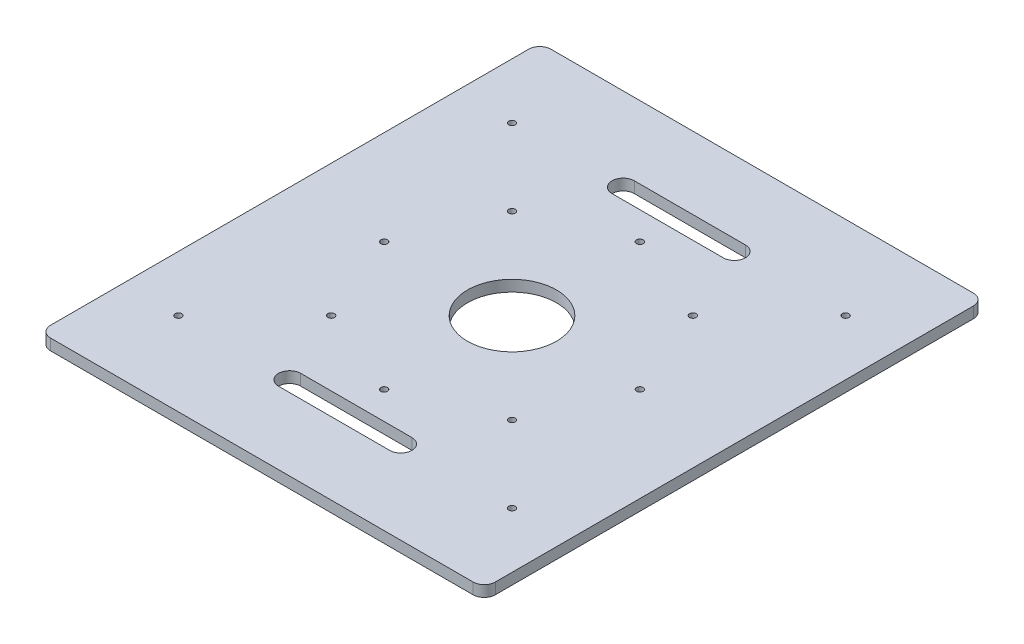
ISO-10303-21;
HEADER;
FILE_DESCRIPTION(('STEP AP214'),'2;1');
FILE_NAME('part.step','',(''),(''),'','','');
FILE_SCHEMA(('AUTOMOTIVE_DESIGN { 1 0 10303 214 1 1 1 1 }'));
ENDSEC;
DATA;
#1=APPLICATION_CONTEXT('core data for automotive mechanical design processes');
#2=APPLICATION_PROTOCOL_DEFINITION('international standard','automotive_design',2000,#1);
#3=PRODUCT_CONTEXT('',#1,'mechanical');
#4=PRODUCT('Part','Part','',(#3));
#5=PRODUCT_RELATED_PRODUCT_CATEGORY('part','',(#4));
#6=PRODUCT_DEFINITION_FORMATION('','',#4);
#7=PRODUCT_DEFINITION_CONTEXT('part definition',#1,'design');
#8=PRODUCT_DEFINITION('design','',#6,#7);
#9=PRODUCT_DEFINITION_SHAPE('','',#8);
#10=(LENGTH_UNIT() NAMED_UNIT(*) SI_UNIT(.MILLI.,.METRE.));
#11=(NAMED_UNIT(*) PLANE_ANGLE_UNIT() SI_UNIT($,.RADIAN.));
#12=(NAMED_UNIT(*) SI_UNIT($,.STERADIAN.) SOLID_ANGLE_UNIT());
#13=UNCERTAINTY_MEASURE_WITH_UNIT(LENGTH_MEASURE(1.E-05),#10,'distance_accuracy_value','');
#14=(GEOMETRIC_REPRESENTATION_CONTEXT(3) GLOBAL_UNCERTAINTY_ASSIGNED_CONTEXT((#13)) GLOBAL_UNIT_ASSIGNED_CONTEXT((#10,
#11,#12)) REPRESENTATION_CONTEXT('',''));
#15=CARTESIAN_POINT('',(0.,0.,0.));
#16=DIRECTION('',(0.,0.,1.));
#17=DIRECTION('',(1.,0.,0.));
#18=AXIS2_PLACEMENT_3D('',#15,#16,#17);
#19=CARTESIAN_POINT('',(190.,10.,-215.));
#20=DIRECTION('',(0.,-1.,0.));
#21=DIRECTION('',(0.,0.,-1.));
#22=AXIS2_PLACEMENT_3D('',#19,#20,#21);
#23=CYLINDRICAL_SURFACE('',#22,10.);
#24=CARTESIAN_POINT('',(190.,0.,-215.));
#25=DIRECTION('',(0.,1.,0.));
#26=DIRECTION('',(0.,0.,1.));
#27=AXIS2_PLACEMENT_3D('',#24,#25,#26);
#28=CIRCLE('',#27,10.);
#29=CARTESIAN_POINT('',(200.,0.,-215.));
#30=VERTEX_POINT('',#29);
#31=CARTESIAN_POINT('',(190.,0.,-225.));
#32=VERTEX_POINT('',#31);
#33=EDGE_CURVE('E300',#30,#32,#28,.T.);
#34=ORIENTED_EDGE('',*,*,#33,.T.);
#35=DIRECTION('',(0.,-1.,0.));
#36=VECTOR('',#35,1.);
#37=CARTESIAN_POINT('',(190.,10.,-225.));
#38=LINE('',#37,#36);
#39=CARTESIAN_POINT('',(190.,10.,-225.));
#40=VERTEX_POINT('',#39);
#41=EDGE_CURVE('E351',#40,#32,#38,.T.);
#42=ORIENTED_EDGE('',*,*,#41,.F.);
#43=CARTESIAN_POINT('',(190.,10.,-215.));
#44=DIRECTION('',(0.,1.,0.));
#45=DIRECTION('',(0.,0.,1.));
#46=AXIS2_PLACEMENT_3D('',#43,#44,#45);
#47=CIRCLE('',#46,10.);
#48=CARTESIAN_POINT('',(200.,10.,-215.));
#49=VERTEX_POINT('',#48);
#50=EDGE_CURVE('E273',#49,#40,#47,.T.);
#51=ORIENTED_EDGE('',*,*,#50,.F.);
#52=DIRECTION('',(0.,-1.,0.));
#53=VECTOR('',#52,1.);
#54=CARTESIAN_POINT('',(200.,10.,-215.));
#55=LINE('',#54,#53);
#56=EDGE_CURVE('E299',#49,#30,#55,.T.);
#57=ORIENTED_EDGE('',*,*,#56,.T.);
#58=EDGE_LOOP('',(#34,#42,#51,#57));
#59=FACE_BOUND('',#58,.T.);
#60=ADVANCED_FACE('F39',(#59),#23,.T.);
#61=CARTESIAN_POINT('',(-190.,10.,-225.));
#62=DIRECTION('',(0.,0.,1.));
#63=DIRECTION('',(1.,0.,0.));
#64=AXIS2_PLACEMENT_3D('',#61,#62,#63);
#65=PLANE('',#64);
#66=DIRECTION('',(-1.,0.,0.));
#67=VECTOR('',#66,1.);
#68=CARTESIAN_POINT('',(-190.,0.,-225.));
#69=LINE('',#68,#67);
#70=CARTESIAN_POINT('',(-190.,0.,-225.));
#71=VERTEX_POINT('',#70);
#72=EDGE_CURVE('E304',#32,#71,#69,.T.);
#73=ORIENTED_EDGE('',*,*,#72,.T.);
#74=DIRECTION('',(0.,-1.,0.));
#75=VECTOR('',#74,1.);
#76=CARTESIAN_POINT('',(-190.,10.,-225.));
#77=LINE('',#76,#75);
#78=CARTESIAN_POINT('',(-190.,10.,-225.));
#79=VERTEX_POINT('',#78);
#80=EDGE_CURVE('E347',#79,#71,#77,.T.);
#81=ORIENTED_EDGE('',*,*,#80,.F.);
#82=DIRECTION('',(-1.,0.,0.));
#83=VECTOR('',#82,1.);
#84=CARTESIAN_POINT('',(-190.,10.,-225.));
#85=LINE('',#84,#83);
#86=EDGE_CURVE('E277',#40,#79,#85,.T.);
#87=ORIENTED_EDGE('',*,*,#86,.F.);
#88=ORIENTED_EDGE('',*,*,#41,.T.);
#89=EDGE_LOOP('',(#73,#81,#87,#88));
#90=FACE_BOUND('',#89,.T.);
#91=ADVANCED_FACE('F445',(#90),#65,.F.);
#92=CARTESIAN_POINT('',(-190.,10.,-215.));
#93=DIRECTION('',(0.,-1.,0.));
#94=DIRECTION('',(0.,0.,-1.));
#95=AXIS2_PLACEMENT_3D('',#92,#93,#94);
#96=CYLINDRICAL_SURFACE('',#95,10.);
#97=CARTESIAN_POINT('',(-190.,0.,-215.));
#98=DIRECTION('',(0.,1.,0.));
#99=DIRECTION('',(0.,0.,1.));
#100=AXIS2_PLACEMENT_3D('',#97,#98,#99);
#101=CIRCLE('',#100,10.);
#102=CARTESIAN_POINT('',(-200.,0.,-215.));
#103=VERTEX_POINT('',#102);
#104=EDGE_CURVE('E307',#71,#103,#101,.T.);
#105=ORIENTED_EDGE('',*,*,#104,.T.);
#106=DIRECTION('',(0.,-1.,0.));
#107=VECTOR('',#106,1.);
#108=CARTESIAN_POINT('',(-200.,10.,-215.));
#109=LINE('',#108,#107);
#110=CARTESIAN_POINT('',(-200.,10.,-215.));
#111=VERTEX_POINT('',#110);
#112=EDGE_CURVE('E343',#111,#103,#109,.T.);
#113=ORIENTED_EDGE('',*,*,#112,.F.);
#114=CARTESIAN_POINT('',(-190.,10.,-215.));
#115=DIRECTION('',(0.,1.,0.));
#116=DIRECTION('',(0.,0.,1.));
#117=AXIS2_PLACEMENT_3D('',#114,#115,#116);
#118=CIRCLE('',#117,10.);
#119=EDGE_CURVE('E281',#79,#111,#118,.T.);
#120=ORIENTED_EDGE('',*,*,#119,.F.);
#121=ORIENTED_EDGE('',*,*,#80,.T.);
#122=EDGE_LOOP('',(#105,#113,#120,#121));
#123=FACE_BOUND('',#122,.T.);
#124=ADVANCED_FACE('F450',(#123),#96,.T.);
#125=CARTESIAN_POINT('',(-200.,10.,-215.));
#126=DIRECTION('',(1.,0.,0.));
#127=DIRECTION('',(0.,0.,-1.));
#128=AXIS2_PLACEMENT_3D('',#125,#126,#127);
#129=PLANE('',#128);
#130=DIRECTION('',(0.,0.,1.));
#131=VECTOR('',#130,1.);
#132=CARTESIAN_POINT('',(-200.,0.,-215.));
#133=LINE('',#132,#131);
#134=CARTESIAN_POINT('',(-200.,0.,215.));
#135=VERTEX_POINT('',#134);
#136=EDGE_CURVE('E310',#103,#135,#133,.T.);
#137=ORIENTED_EDGE('',*,*,#136,.T.);
#138=DIRECTION('',(0.,-1.,0.));
#139=VECTOR('',#138,1.);
#140=CARTESIAN_POINT('',(-200.,10.,215.));
#141=LINE('',#140,#139);
#142=CARTESIAN_POINT('',(-200.,10.,215.));
#143=VERTEX_POINT('',#142);
#144=EDGE_CURVE('E339',#143,#135,#141,.T.);
#145=ORIENTED_EDGE('',*,*,#144,.F.);
#146=DIRECTION('',(0.,0.,1.));
#147=VECTOR('',#146,1.);
#148=CARTESIAN_POINT('',(-200.,10.,-215.));
#149=LINE('',#148,#147);
#150=EDGE_CURVE('E284',#111,#143,#149,.T.);
#151=ORIENTED_EDGE('',*,*,#150,.F.);
#152=ORIENTED_EDGE('',*,*,#112,.T.);
#153=EDGE_LOOP('',(#137,#145,#151,#152));
#154=FACE_BOUND('',#153,.T.);
#155=ADVANCED_FACE('F484',(#154),#129,.F.);
#156=CARTESIAN_POINT('',(-190.,10.,215.));
#157=DIRECTION('',(0.,-1.,0.));
#158=DIRECTION('',(0.,0.,-1.));
#159=AXIS2_PLACEMENT_3D('',#156,#157,#158);
#160=CYLINDRICAL_SURFACE('',#159,10.);
#161=CARTESIAN_POINT('',(-190.,0.,215.));
#162=DIRECTION('',(0.,1.,0.));
#163=DIRECTION('',(0.,0.,1.));
#164=AXIS2_PLACEMENT_3D('',#161,#162,#163);
#165=CIRCLE('',#164,10.);
#166=CARTESIAN_POINT('',(-190.,0.,225.));
#167=VERTEX_POINT('',#166);
#168=EDGE_CURVE('E313',#135,#167,#165,.T.);
#169=ORIENTED_EDGE('',*,*,#168,.T.);
#170=DIRECTION('',(0.,-1.,0.));
#171=VECTOR('',#170,1.);
#172=CARTESIAN_POINT('',(-190.,10.,225.));
#173=LINE('',#172,#171);
#174=CARTESIAN_POINT('',(-190.,10.,225.));
#175=VERTEX_POINT('',#174);
#176=EDGE_CURVE('E335',#175,#167,#173,.T.);
#177=ORIENTED_EDGE('',*,*,#176,.F.);
#178=CARTESIAN_POINT('',(-190.,10.,215.));
#179=DIRECTION('',(0.,1.,0.));
#180=DIRECTION('',(0.,0.,1.));
#181=AXIS2_PLACEMENT_3D('',#178,#179,#180);
#182=CIRCLE('',#181,10.);
#183=EDGE_CURVE('E287',#143,#175,#182,.T.);
#184=ORIENTED_EDGE('',*,*,#183,.F.);
#185=ORIENTED_EDGE('',*,*,#144,.T.);
#186=EDGE_LOOP('',(#169,#177,#184,#185));
#187=FACE_BOUND('',#186,.T.);
#188=ADVANCED_FACE('F480',(#187),#160,.T.);
#189=CARTESIAN_POINT('',(-190.,10.,225.));
#190=DIRECTION('',(0.,0.,-1.));
#191=DIRECTION('',(-1.,0.,0.));
#192=AXIS2_PLACEMENT_3D('',#189,#190,#191);
#193=PLANE('',#192);
#194=DIRECTION('',(1.,0.,0.));
#195=VECTOR('',#194,1.);
#196=CARTESIAN_POINT('',(-190.,0.,225.));
#197=LINE('',#196,#195);
#198=CARTESIAN_POINT('',(190.,0.,225.));
#199=VERTEX_POINT('',#198);
#200=EDGE_CURVE('E316',#167,#199,#197,.T.);
#201=ORIENTED_EDGE('',*,*,#200,.T.);
#202=DIRECTION('',(0.,-1.,0.));
#203=VECTOR('',#202,1.);
#204=CARTESIAN_POINT('',(190.,10.,225.));
#205=LINE('',#204,#203);
#206=CARTESIAN_POINT('',(190.,10.,225.));
#207=VERTEX_POINT('',#206);
#208=EDGE_CURVE('E331',#207,#199,#205,.T.);
#209=ORIENTED_EDGE('',*,*,#208,.F.);
#210=DIRECTION('',(1.,0.,0.));
#211=VECTOR('',#210,1.);
#212=CARTESIAN_POINT('',(-190.,10.,225.));
#213=LINE('',#212,#211);
#214=EDGE_CURVE('E290',#175,#207,#213,.T.);
#215=ORIENTED_EDGE('',*,*,#214,.F.);
#216=ORIENTED_EDGE('',*,*,#176,.T.);
#217=EDGE_LOOP('',(#201,#209,#215,#216));
#218=FACE_BOUND('',#217,.T.);
#219=ADVANCED_FACE('F475',(#218),#193,.F.);
#220=CARTESIAN_POINT('',(190.,10.,215.));
#221=DIRECTION('',(0.,-1.,0.));
#222=DIRECTION('',(0.,0.,-1.));
#223=AXIS2_PLACEMENT_3D('',#220,#221,#222);
#224=CYLINDRICAL_SURFACE('',#223,9.99999999999999);
#225=CARTESIAN_POINT('',(190.,0.,215.));
#226=DIRECTION('',(0.,1.,0.));
#227=DIRECTION('',(0.,0.,1.));
#228=AXIS2_PLACEMENT_3D('',#225,#226,#227);
#229=CIRCLE('',#228,9.99999999999999);
#230=CARTESIAN_POINT('',(200.,0.,215.));
#231=VERTEX_POINT('',#230);
#232=EDGE_CURVE('E319',#199,#231,#229,.T.);
#233=ORIENTED_EDGE('',*,*,#232,.T.);
#234=DIRECTION('',(0.,-1.,0.));
#235=VECTOR('',#234,1.);
#236=CARTESIAN_POINT('',(200.,10.,215.));
#237=LINE('',#236,#235);
#238=CARTESIAN_POINT('',(200.,10.,215.));
#239=VERTEX_POINT('',#238);
#240=EDGE_CURVE('E327',#239,#231,#237,.T.);
#241=ORIENTED_EDGE('',*,*,#240,.F.);
#242=CARTESIAN_POINT('',(190.,10.,215.));
#243=DIRECTION('',(0.,1.,0.));
#244=DIRECTION('',(0.,0.,1.));
#245=AXIS2_PLACEMENT_3D('',#242,#243,#244);
#246=CIRCLE('',#245,9.99999999999999);
#247=EDGE_CURVE('E293',#207,#239,#246,.T.);
#248=ORIENTED_EDGE('',*,*,#247,.F.);
#249=ORIENTED_EDGE('',*,*,#208,.T.);
#250=EDGE_LOOP('',(#233,#241,#248,#249));
#251=FACE_BOUND('',#250,.T.);
#252=ADVANCED_FACE('F470',(#251),#224,.T.);
#253=CARTESIAN_POINT('',(200.,10.,-215.));
#254=DIRECTION('',(-1.,0.,0.));
#255=DIRECTION('',(0.,0.,1.));
#256=AXIS2_PLACEMENT_3D('',#253,#254,#255);
#257=PLANE('',#256);
#258=DIRECTION('',(0.,0.,-1.));
#259=VECTOR('',#258,1.);
#260=CARTESIAN_POINT('',(200.,0.,-215.));
#261=LINE('',#260,#259);
#262=EDGE_CURVE('E278',#231,#30,#261,.T.);
#263=ORIENTED_EDGE('',*,*,#262,.T.);
#264=ORIENTED_EDGE('',*,*,#56,.F.);
#265=DIRECTION('',(0.,0.,-1.));
#266=VECTOR('',#265,1.);
#267=CARTESIAN_POINT('',(200.,10.,-215.));
#268=LINE('',#267,#266);
#269=EDGE_CURVE('E296',#239,#49,#268,.T.);
#270=ORIENTED_EDGE('',*,*,#269,.F.);
#271=ORIENTED_EDGE('',*,*,#240,.T.);
#272=EDGE_LOOP('',(#263,#264,#270,#271));
#273=FACE_BOUND('',#272,.T.);
#274=ADVANCED_FACE('F468',(#273),#257,.F.);
#275=CARTESIAN_POINT('',(190.,10.,-215.));
#276=DIRECTION('',(0.,1.,0.));
#277=DIRECTION('',(0.,0.,1.));
#278=AXIS2_PLACEMENT_3D('',#275,#276,#277);
#279=PLANE('',#278);
#280=CARTESIAN_POINT('',(-81.317279836453,10.,-81.317279836453));
#281=DIRECTION('',(0.,1.,0.));
#282=DIRECTION('',(0.,0.,1.));
#283=AXIS2_PLACEMENT_3D('',#280,#281,#282);
#284=CIRCLE('',#283,3.00000000000001);
#285=CARTESIAN_POINT('',(-81.317279836453,10.,-78.317279836453));
#286=VERTEX_POINT('',#285);
#287=EDGE_CURVE('E225',#286,#286,#284,.T.);
#288=ORIENTED_EDGE('',*,*,#287,.F.);
#289=EDGE_LOOP('',(#288));
#290=FACE_BOUND('',#289,.T.);
#291=CARTESIAN_POINT('',(-115.,10.,0.));
#292=DIRECTION('',(0.,1.,0.));
#293=DIRECTION('',(0.,0.,1.));
#294=AXIS2_PLACEMENT_3D('',#291,#292,#293);
#295=CIRCLE('',#294,2.99999999999999);
#296=CARTESIAN_POINT('',(-115.,10.,3.00000000000001));
#297=VERTEX_POINT('',#296);
#298=EDGE_CURVE('E246',#297,#297,#295,.T.);
#299=ORIENTED_EDGE('',*,*,#298,.F.);
#300=EDGE_LOOP('',(#299));
#301=FACE_BOUND('',#300,.T.);
#302=CARTESIAN_POINT('',(-81.317279836453,10.,81.317279836453));
#303=DIRECTION('',(0.,1.,0.));
#304=DIRECTION('',(0.,0.,1.));
#305=AXIS2_PLACEMENT_3D('',#302,#303,#304);
#306=CIRCLE('',#305,3.00000000000001);
#307=CARTESIAN_POINT('',(-81.317279836453,10.,84.317279836453));
#308=VERTEX_POINT('',#307);
#309=EDGE_CURVE('E242',#308,#308,#306,.T.);
#310=ORIENTED_EDGE('',*,*,#309,.F.);
#311=EDGE_LOOP('',(#310));
#312=FACE_BOUND('',#311,.T.);
#313=CARTESIAN_POINT('',(0.,10.,115.));
#314=DIRECTION('',(0.,1.,0.));
#315=DIRECTION('',(0.,0.,1.));
#316=AXIS2_PLACEMENT_3D('',#313,#314,#315);
#317=CIRCLE('',#316,3.);
#318=CARTESIAN_POINT('',(0.,10.,118.));
#319=VERTEX_POINT('',#318);
#320=EDGE_CURVE('E237',#319,#319,#317,.T.);
#321=ORIENTED_EDGE('',*,*,#320,.F.);
#322=EDGE_LOOP('',(#321));
#323=FACE_BOUND('',#322,.T.);
#324=CARTESIAN_POINT('',(81.317279836453,10.,81.317279836453));
#325=DIRECTION('',(0.,1.,0.));
#326=DIRECTION('',(0.,0.,1.));
#327=AXIS2_PLACEMENT_3D('',#324,#325,#326);
#328=CIRCLE('',#327,3.00000000000001);
#329=CARTESIAN_POINT('',(81.317279836453,10.,84.317279836453));
#330=VERTEX_POINT('',#329);
#331=EDGE_CURVE('E241',#330,#330,#328,.T.);
#332=ORIENTED_EDGE('',*,*,#331,.F.);
#333=EDGE_LOOP('',(#332));
#334=FACE_BOUND('',#333,.T.);
#335=CARTESIAN_POINT('',(115.,10.,0.));
#336=DIRECTION('',(0.,1.,0.));
#337=DIRECTION('',(0.,0.,1.));
#338=AXIS2_PLACEMENT_3D('',#335,#336,#337);
#339=CIRCLE('',#338,3.00000000000001);
#340=CARTESIAN_POINT('',(115.,10.,3.));
#341=VERTEX_POINT('',#340);
#342=EDGE_CURVE('E262',#341,#341,#339,.T.);
#343=ORIENTED_EDGE('',*,*,#342,.F.);
#344=EDGE_LOOP('',(#343));
#345=FACE_BOUND('',#344,.T.);
#346=CARTESIAN_POINT('',(81.317279836453,10.,-81.317279836453));
#347=DIRECTION('',(0.,1.,0.));
#348=DIRECTION('',(0.,0.,1.));
#349=AXIS2_PLACEMENT_3D('',#346,#347,#348);
#350=CIRCLE('',#349,2.99999999999999);
#351=CARTESIAN_POINT('',(81.317279836453,10.,-78.317279836453));
#352=VERTEX_POINT('',#351);
#353=EDGE_CURVE('E258',#352,#352,#350,.T.);
#354=ORIENTED_EDGE('',*,*,#353,.F.);
#355=EDGE_LOOP('',(#354));
#356=FACE_BOUND('',#355,.T.);
#357=CARTESIAN_POINT('',(0.,10.,-115.));
#358=DIRECTION('',(0.,1.,0.));
#359=DIRECTION('',(0.,0.,1.));
#360=AXIS2_PLACEMENT_3D('',#357,#358,#359);
#361=CIRCLE('',#360,3.);
#362=CARTESIAN_POINT('',(0.,10.,-112.));
#363=VERTEX_POINT('',#362);
#364=EDGE_CURVE('E253',#363,#363,#361,.T.);
#365=ORIENTED_EDGE('',*,*,#364,.F.);
#366=EDGE_LOOP('',(#365));
#367=FACE_BOUND('',#366,.T.);
#368=CARTESIAN_POINT('',(-50.,10.,-150.));
#369=DIRECTION('',(0.,1.,0.));
#370=DIRECTION('',(0.,0.,-1.));
#371=AXIS2_PLACEMENT_3D('',#368,#369,#370);
#372=CIRCLE('',#371,10.);
#373=CARTESIAN_POINT('',(-50.,10.,-160.));
#374=VERTEX_POINT('',#373);
#375=CARTESIAN_POINT('',(-50.,10.,-140.));
#376=VERTEX_POINT('',#375);
#377=EDGE_CURVE('E56',#374,#376,#372,.T.);
#378=ORIENTED_EDGE('',*,*,#377,.F.);
#379=DIRECTION('',(-1.,0.,0.));
#380=VECTOR('',#379,1.);
#381=CARTESIAN_POINT('',(-50.,10.,-160.));
#382=LINE('',#381,#380);
#383=CARTESIAN_POINT('',(50.,10.,-160.));
#384=VERTEX_POINT('',#383);
#385=EDGE_CURVE('E205',#384,#374,#382,.T.);
#386=ORIENTED_EDGE('',*,*,#385,.F.);
#387=CARTESIAN_POINT('',(50.,10.,-150.));
#388=DIRECTION('',(0.,1.,0.));
#389=DIRECTION('',(0.,0.,-1.));
#390=AXIS2_PLACEMENT_3D('',#387,#388,#389);
#391=CIRCLE('',#390,10.);
#392=CARTESIAN_POINT('',(50.,10.,-140.));
#393=VERTEX_POINT('',#392);
#394=EDGE_CURVE('E201',#393,#384,#391,.T.);
#395=ORIENTED_EDGE('',*,*,#394,.F.);
#396=DIRECTION('',(1.,0.,0.));
#397=VECTOR('',#396,1.);
#398=CARTESIAN_POINT('',(-50.,10.,-140.));
#399=LINE('',#398,#397);
#400=EDGE_CURVE('E197',#376,#393,#399,.T.);
#401=ORIENTED_EDGE('',*,*,#400,.F.);
#402=EDGE_LOOP('',(#378,#386,#395,#401));
#403=FACE_BOUND('',#402,.T.);
#404=CARTESIAN_POINT('',(-50.,10.,150.));
#405=DIRECTION('',(0.,1.,0.));
#406=DIRECTION('',(0.,0.,1.));
#407=AXIS2_PLACEMENT_3D('',#404,#405,#406);
#408=CIRCLE('',#407,10.);
#409=CARTESIAN_POINT('',(-50.,10.,140.));
#410=VERTEX_POINT('',#409);
#411=CARTESIAN_POINT('',(-50.,10.,160.));
#412=VERTEX_POINT('',#411);
#413=EDGE_CURVE('E64',#410,#412,#408,.T.);
#414=ORIENTED_EDGE('',*,*,#413,.F.);
#415=DIRECTION('',(-1.,0.,0.));
#416=VECTOR('',#415,1.);
#417=CARTESIAN_POINT('',(-50.,10.,140.));
#418=LINE('',#417,#416);
#419=CARTESIAN_POINT('',(50.,10.,140.));
#420=VERTEX_POINT('',#419);
#421=EDGE_CURVE('E180',#420,#410,#418,.T.);
#422=ORIENTED_EDGE('',*,*,#421,.F.);
#423=CARTESIAN_POINT('',(50.,10.,150.));
#424=DIRECTION('',(0.,1.,0.));
#425=DIRECTION('',(0.,0.,1.));
#426=AXIS2_PLACEMENT_3D('',#423,#424,#425);
#427=CIRCLE('',#426,10.);
#428=CARTESIAN_POINT('',(50.,10.,160.));
#429=VERTEX_POINT('',#428);
#430=EDGE_CURVE('E161',#429,#420,#427,.T.);
#431=ORIENTED_EDGE('',*,*,#430,.F.);
#432=DIRECTION('',(1.,0.,0.));
#433=VECTOR('',#432,1.);
#434=CARTESIAN_POINT('',(-50.,10.,160.));
#435=LINE('',#434,#433);
#436=EDGE_CURVE('E172',#412,#429,#435,.T.);
#437=ORIENTED_EDGE('',*,*,#436,.F.);
#438=EDGE_LOOP('',(#414,#422,#431,#437));
#439=FACE_BOUND('',#438,.T.);
#440=CARTESIAN_POINT('',(150.,10.,150.));
#441=DIRECTION('',(0.,1.,0.));
#442=DIRECTION('',(0.,0.,1.));
#443=AXIS2_PLACEMENT_3D('',#440,#441,#442);
#444=CIRCLE('',#443,3.00000000000002);
#445=CARTESIAN_POINT('',(150.,10.,153.));
#446=VERTEX_POINT('',#445);
#447=EDGE_CURVE('E190',#446,#446,#444,.T.);
#448=ORIENTED_EDGE('',*,*,#447,.F.);
#449=EDGE_LOOP('',(#448));
#450=FACE_BOUND('',#449,.T.);
#451=CARTESIAN_POINT('',(-150.,10.,150.));
#452=DIRECTION('',(0.,1.,0.));
#453=DIRECTION('',(0.,0.,1.));
#454=AXIS2_PLACEMENT_3D('',#451,#452,#453);
#455=CIRCLE('',#454,2.99999999999999);
#456=CARTESIAN_POINT('',(-150.,10.,153.));
#457=VERTEX_POINT('',#456);
#458=EDGE_CURVE('E230',#457,#457,#455,.T.);
#459=ORIENTED_EDGE('',*,*,#458,.F.);
#460=EDGE_LOOP('',(#459));
#461=FACE_BOUND('',#460,.T.);
#462=CARTESIAN_POINT('',(150.,10.,-150.));
#463=DIRECTION('',(0.,1.,0.));
#464=DIRECTION('',(0.,0.,1.));
#465=AXIS2_PLACEMENT_3D('',#462,#463,#464);
#466=CIRCLE('',#465,2.99999999999999);
#467=CARTESIAN_POINT('',(150.,10.,-147.));
#468=VERTEX_POINT('',#467);
#469=EDGE_CURVE('E226',#468,#468,#466,.T.);
#470=ORIENTED_EDGE('',*,*,#469,.F.);
#471=EDGE_LOOP('',(#470));
#472=FACE_BOUND('',#471,.T.);
#473=CARTESIAN_POINT('',(-150.,10.,-150.));
#474=DIRECTION('',(0.,1.,0.));
#475=DIRECTION('',(0.,0.,1.));
#476=AXIS2_PLACEMENT_3D('',#473,#474,#475);
#477=CIRCLE('',#476,2.99999999999999);
#478=CARTESIAN_POINT('',(-150.,10.,-147.));
#479=VERTEX_POINT('',#478);
#480=EDGE_CURVE('E221',#479,#479,#477,.T.);
#481=ORIENTED_EDGE('',*,*,#480,.F.);
#482=EDGE_LOOP('',(#481));
#483=FACE_BOUND('',#482,.T.);
#484=CARTESIAN_POINT('',(0.,10.,0.));
#485=DIRECTION('',(0.,1.,0.));
#486=DIRECTION('',(0.,0.,1.));
#487=AXIS2_PLACEMENT_3D('',#484,#485,#486);
#488=CIRCLE('',#487,40.);
#489=CARTESIAN_POINT('',(0.,10.,40.));
#490=VERTEX_POINT('',#489);
#491=EDGE_CURVE('E257',#490,#490,#488,.T.);
#492=ORIENTED_EDGE('',*,*,#491,.F.);
#493=EDGE_LOOP('',(#492));
#494=FACE_BOUND('',#493,.T.);
#495=ORIENTED_EDGE('',*,*,#50,.T.);
#496=ORIENTED_EDGE('',*,*,#86,.T.);
#497=ORIENTED_EDGE('',*,*,#119,.T.);
#498=ORIENTED_EDGE('',*,*,#150,.T.);
#499=ORIENTED_EDGE('',*,*,#183,.T.);
#500=ORIENTED_EDGE('',*,*,#214,.T.);
#501=ORIENTED_EDGE('',*,*,#247,.T.);
#502=ORIENTED_EDGE('',*,*,#269,.T.);
#503=EDGE_LOOP('',(#495,#496,#497,#498,#499,#500,#501,#502));
#504=FACE_BOUND('',#503,.T.);
#505=ADVANCED_FACE('F177',(#290,#301,#312,#323,#334,#345,#356,#367,#403,#439,#450,#461,#472,
#483,#494,#504),#279,.T.);
#506=CARTESIAN_POINT('',(190.,0.,-215.));
#507=DIRECTION('',(0.,1.,0.));
#508=DIRECTION('',(0.,0.,1.));
#509=AXIS2_PLACEMENT_3D('',#506,#507,#508);
#510=PLANE('',#509);
#511=CARTESIAN_POINT('',(-81.317279836453,0.,-81.317279836453));
#512=DIRECTION('',(0.,1.,0.));
#513=DIRECTION('',(0.,0.,1.));
#514=AXIS2_PLACEMENT_3D('',#511,#512,#513);
#515=CIRCLE('',#514,3.00000000000001);
#516=CARTESIAN_POINT('',(-81.317279836453,0.,-78.317279836453));
#517=VERTEX_POINT('',#516);
#518=EDGE_CURVE('E42',#517,#517,#515,.T.);
#519=ORIENTED_EDGE('',*,*,#518,.T.);
#520=EDGE_LOOP('',(#519));
#521=FACE_BOUND('',#520,.T.);
#522=CARTESIAN_POINT('',(-115.,0.,0.));
#523=DIRECTION('',(0.,1.,0.));
#524=DIRECTION('',(0.,0.,1.));
#525=AXIS2_PLACEMENT_3D('',#522,#523,#524);
#526=CIRCLE('',#525,2.99999999999999);
#527=CARTESIAN_POINT('',(-115.,0.,3.00000000000001));
#528=VERTEX_POINT('',#527);
#529=EDGE_CURVE('E421',#528,#528,#526,.T.);
#530=ORIENTED_EDGE('',*,*,#529,.T.);
#531=EDGE_LOOP('',(#530));
#532=FACE_BOUND('',#531,.T.);
#533=CARTESIAN_POINT('',(-81.317279836453,0.,81.317279836453));
#534=DIRECTION('',(0.,1.,0.));
#535=DIRECTION('',(0.,0.,1.));
#536=AXIS2_PLACEMENT_3D('',#533,#534,#535);
#537=CIRCLE('',#536,3.00000000000001);
#538=CARTESIAN_POINT('',(-81.317279836453,0.,84.317279836453));
#539=VERTEX_POINT('',#538);
#540=EDGE_CURVE('E418',#539,#539,#537,.T.);
#541=ORIENTED_EDGE('',*,*,#540,.T.);
#542=EDGE_LOOP('',(#541));
#543=FACE_BOUND('',#542,.T.);
#544=CARTESIAN_POINT('',(0.,0.,115.));
#545=DIRECTION('',(0.,1.,0.));
#546=DIRECTION('',(0.,0.,1.));
#547=AXIS2_PLACEMENT_3D('',#544,#545,#546);
#548=CIRCLE('',#547,3.);
#549=CARTESIAN_POINT('',(0.,0.,118.));
#550=VERTEX_POINT('',#549);
#551=EDGE_CURVE('E414',#550,#550,#548,.T.);
#552=ORIENTED_EDGE('',*,*,#551,.T.);
#553=EDGE_LOOP('',(#552));
#554=FACE_BOUND('',#553,.T.);
#555=CARTESIAN_POINT('',(81.317279836453,0.,81.317279836453));
#556=DIRECTION('',(0.,1.,0.));
#557=DIRECTION('',(0.,0.,1.));
#558=AXIS2_PLACEMENT_3D('',#555,#556,#557);
#559=CIRCLE('',#558,3.00000000000001);
#560=CARTESIAN_POINT('',(81.317279836453,0.,84.317279836453));
#561=VERTEX_POINT('',#560);
#562=EDGE_CURVE('E410',#561,#561,#559,.T.);
#563=ORIENTED_EDGE('',*,*,#562,.T.);
#564=EDGE_LOOP('',(#563));
#565=FACE_BOUND('',#564,.T.);
#566=CARTESIAN_POINT('',(115.,0.,0.));
#567=DIRECTION('',(0.,1.,0.));
#568=DIRECTION('',(0.,0.,1.));
#569=AXIS2_PLACEMENT_3D('',#566,#567,#568);
#570=CIRCLE('',#569,3.00000000000001);
#571=CARTESIAN_POINT('',(115.,0.,3.));
#572=VERTEX_POINT('',#571);
#573=EDGE_CURVE('E406',#572,#572,#570,.T.);
#574=ORIENTED_EDGE('',*,*,#573,.T.);
#575=EDGE_LOOP('',(#574));
#576=FACE_BOUND('',#575,.T.);
#577=CARTESIAN_POINT('',(81.317279836453,0.,-81.317279836453));
#578=DIRECTION('',(0.,1.,0.));
#579=DIRECTION('',(0.,0.,1.));
#580=AXIS2_PLACEMENT_3D('',#577,#578,#579);
#581=CIRCLE('',#580,2.99999999999999);
#582=CARTESIAN_POINT('',(81.317279836453,0.,-78.317279836453));
#583=VERTEX_POINT('',#582);
#584=EDGE_CURVE('E402',#583,#583,#581,.T.);
#585=ORIENTED_EDGE('',*,*,#584,.T.);
#586=EDGE_LOOP('',(#585));
#587=FACE_BOUND('',#586,.T.);
#588=CARTESIAN_POINT('',(0.,0.,-115.));
#589=DIRECTION('',(0.,1.,0.));
#590=DIRECTION('',(0.,0.,1.));
#591=AXIS2_PLACEMENT_3D('',#588,#589,#590);
#592=CIRCLE('',#591,3.);
#593=CARTESIAN_POINT('',(0.,0.,-112.));
#594=VERTEX_POINT('',#593);
#595=EDGE_CURVE('E375',#594,#594,#592,.T.);
#596=ORIENTED_EDGE('',*,*,#595,.T.);
#597=EDGE_LOOP('',(#596));
#598=FACE_BOUND('',#597,.T.);
#599=DIRECTION('',(-1.,0.,0.));
#600=VECTOR('',#599,1.);
#601=CARTESIAN_POINT('',(190.,0.,-160.));
#602=LINE('',#601,#600);
#603=CARTESIAN_POINT('',(50.,0.,-160.));
#604=VERTEX_POINT('',#603);
#605=CARTESIAN_POINT('',(-50.,0.,-160.));
#606=VERTEX_POINT('',#605);
#607=EDGE_CURVE('E48',#604,#606,#602,.T.);
#608=ORIENTED_EDGE('',*,*,#607,.T.);
#609=CARTESIAN_POINT('',(-50.,0.,-150.));
#610=DIRECTION('',(0.,1.,0.));
#611=DIRECTION('',(0.,0.,1.));
#612=AXIS2_PLACEMENT_3D('',#609,#610,#611);
#613=CIRCLE('',#612,10.);
#614=CARTESIAN_POINT('',(-50.,0.,-140.));
#615=VERTEX_POINT('',#614);
#616=EDGE_CURVE('E11',#606,#615,#613,.T.);
#617=ORIENTED_EDGE('',*,*,#616,.T.);
#618=DIRECTION('',(1.,0.,0.));
#619=VECTOR('',#618,1.);
#620=CARTESIAN_POINT('',(190.,0.,-140.));
#621=LINE('',#620,#619);
#622=CARTESIAN_POINT('',(50.,0.,-140.));
#623=VERTEX_POINT('',#622);
#624=EDGE_CURVE('E388',#615,#623,#621,.T.);
#625=ORIENTED_EDGE('',*,*,#624,.T.);
#626=CARTESIAN_POINT('',(50.,0.,-150.));
#627=DIRECTION('',(0.,1.,0.));
#628=DIRECTION('',(0.,0.,1.));
#629=AXIS2_PLACEMENT_3D('',#626,#627,#628);
#630=CIRCLE('',#629,10.);
#631=EDGE_CURVE('E392',#623,#604,#630,.T.);
#632=ORIENTED_EDGE('',*,*,#631,.T.);
#633=EDGE_LOOP('',(#608,#617,#625,#632));
#634=FACE_BOUND('',#633,.T.);
#635=DIRECTION('',(-1.,0.,0.));
#636=VECTOR('',#635,1.);
#637=CARTESIAN_POINT('',(190.,0.,140.));
#638=LINE('',#637,#636);
#639=CARTESIAN_POINT('',(50.,0.,140.));
#640=VERTEX_POINT('',#639);
#641=CARTESIAN_POINT('',(-50.,0.,140.));
#642=VERTEX_POINT('',#641);
#643=EDGE_CURVE('E380',#640,#642,#638,.T.);
#644=ORIENTED_EDGE('',*,*,#643,.T.);
#645=CARTESIAN_POINT('',(-50.,0.,150.));
#646=DIRECTION('',(0.,1.,0.));
#647=DIRECTION('',(0.,0.,1.));
#648=AXIS2_PLACEMENT_3D('',#645,#646,#647);
#649=CIRCLE('',#648,10.);
#650=CARTESIAN_POINT('',(-50.,0.,160.));
#651=VERTEX_POINT('',#650);
#652=EDGE_CURVE('E384',#642,#651,#649,.T.);
#653=ORIENTED_EDGE('',*,*,#652,.T.);
#654=DIRECTION('',(1.,0.,0.));
#655=VECTOR('',#654,1.);
#656=CARTESIAN_POINT('',(190.,0.,160.));
#657=LINE('',#656,#655);
#658=CARTESIAN_POINT('',(50.,0.,160.));
#659=VERTEX_POINT('',#658);
#660=EDGE_CURVE('E355',#651,#659,#657,.T.);
#661=ORIENTED_EDGE('',*,*,#660,.T.);
#662=CARTESIAN_POINT('',(50.,0.,150.));
#663=DIRECTION('',(0.,1.,0.));
#664=DIRECTION('',(0.,0.,1.));
#665=AXIS2_PLACEMENT_3D('',#662,#663,#664);
#666=CIRCLE('',#665,10.);
#667=EDGE_CURVE('E164',#659,#640,#666,.T.);
#668=ORIENTED_EDGE('',*,*,#667,.T.);
#669=EDGE_LOOP('',(#644,#653,#661,#668));
#670=FACE_BOUND('',#669,.T.);
#671=CARTESIAN_POINT('',(150.,0.,150.));
#672=DIRECTION('',(0.,1.,0.));
#673=DIRECTION('',(0.,0.,1.));
#674=AXIS2_PLACEMENT_3D('',#671,#672,#673);
#675=CIRCLE('',#674,3.00000000000002);
#676=CARTESIAN_POINT('',(150.,0.,153.));
#677=VERTEX_POINT('',#676);
#678=EDGE_CURVE('E371',#677,#677,#675,.T.);
#679=ORIENTED_EDGE('',*,*,#678,.T.);
#680=EDGE_LOOP('',(#679));
#681=FACE_BOUND('',#680,.T.);
#682=CARTESIAN_POINT('',(-150.,0.,150.));
#683=DIRECTION('',(0.,1.,0.));
#684=DIRECTION('',(0.,0.,1.));
#685=AXIS2_PLACEMENT_3D('',#682,#683,#684);
#686=CIRCLE('',#685,2.99999999999999);
#687=CARTESIAN_POINT('',(-150.,0.,153.));
#688=VERTEX_POINT('',#687);
#689=EDGE_CURVE('E367',#688,#688,#686,.T.);
#690=ORIENTED_EDGE('',*,*,#689,.T.);
#691=EDGE_LOOP('',(#690));
#692=FACE_BOUND('',#691,.T.);
#693=CARTESIAN_POINT('',(150.,0.,-150.));
#694=DIRECTION('',(0.,1.,0.));
#695=DIRECTION('',(0.,0.,1.));
#696=AXIS2_PLACEMENT_3D('',#693,#694,#695);
#697=CIRCLE('',#696,2.99999999999999);
#698=CARTESIAN_POINT('',(150.,0.,-147.));
#699=VERTEX_POINT('',#698);
#700=EDGE_CURVE('E363',#699,#699,#697,.T.);
#701=ORIENTED_EDGE('',*,*,#700,.T.);
#702=EDGE_LOOP('',(#701));
#703=FACE_BOUND('',#702,.T.);
#704=CARTESIAN_POINT('',(-150.,0.,-150.));
#705=DIRECTION('',(0.,1.,0.));
#706=DIRECTION('',(0.,0.,1.));
#707=AXIS2_PLACEMENT_3D('',#704,#705,#706);
#708=CIRCLE('',#707,2.99999999999999);
#709=CARTESIAN_POINT('',(-150.,0.,-147.));
#710=VERTEX_POINT('',#709);
#711=EDGE_CURVE('E359',#710,#710,#708,.T.);
#712=ORIENTED_EDGE('',*,*,#711,.T.);
#713=EDGE_LOOP('',(#712));
#714=FACE_BOUND('',#713,.T.);
#715=CARTESIAN_POINT('',(0.,0.,0.));
#716=DIRECTION('',(0.,1.,0.));
#717=DIRECTION('',(0.,0.,1.));
#718=AXIS2_PLACEMENT_3D('',#715,#716,#717);
#719=CIRCLE('',#718,40.);
#720=CARTESIAN_POINT('',(0.,0.,40.));
#721=VERTEX_POINT('',#720);
#722=EDGE_CURVE('E272',#721,#721,#719,.T.);
#723=ORIENTED_EDGE('',*,*,#722,.T.);
#724=EDGE_LOOP('',(#723));
#725=FACE_BOUND('',#724,.T.);
#726=ORIENTED_EDGE('',*,*,#33,.F.);
#727=ORIENTED_EDGE('',*,*,#262,.F.);
#728=ORIENTED_EDGE('',*,*,#232,.F.);
#729=ORIENTED_EDGE('',*,*,#200,.F.);
#730=ORIENTED_EDGE('',*,*,#168,.F.);
#731=ORIENTED_EDGE('',*,*,#136,.F.);
#732=ORIENTED_EDGE('',*,*,#104,.F.);
#733=ORIENTED_EDGE('',*,*,#72,.F.);
#734=EDGE_LOOP('',(#726,#727,#728,#729,#730,#731,#732,#733));
#735=FACE_BOUND('',#734,.T.);
#736=ADVANCED_FACE('F430',(#521,#532,#543,#554,#565,#576,#587,#598,#634,#670,#681,#692,#703,
#714,#725,#735),#510,.F.);
#737=CARTESIAN_POINT('',(0.,-5.,0.));
#738=DIRECTION('',(0.,1.,0.));
#739=DIRECTION('',(0.,0.,1.));
#740=AXIS2_PLACEMENT_3D('',#737,#738,#739);
#741=CYLINDRICAL_SURFACE('',#740,40.);
#742=ORIENTED_EDGE('',*,*,#491,.T.);
#743=EDGE_LOOP('',(#742));
#744=FACE_BOUND('',#743,.T.);
#745=ORIENTED_EDGE('',*,*,#722,.F.);
#746=EDGE_LOOP('',(#745));
#747=FACE_BOUND('',#746,.T.);
#748=ADVANCED_FACE('F504',(#744,#747),#741,.F.);
#749=CARTESIAN_POINT('',(-150.,-5.,-150.));
#750=DIRECTION('',(0.,1.,0.));
#751=DIRECTION('',(0.,0.,1.));
#752=AXIS2_PLACEMENT_3D('',#749,#750,#751);
#753=CYLINDRICAL_SURFACE('',#752,2.99999999999999);
#754=ORIENTED_EDGE('',*,*,#480,.T.);
#755=EDGE_LOOP('',(#754));
#756=FACE_BOUND('',#755,.T.);
#757=ORIENTED_EDGE('',*,*,#711,.F.);
#758=EDGE_LOOP('',(#757));
#759=FACE_BOUND('',#758,.T.);
#760=ADVANCED_FACE('F510',(#756,#759),#753,.F.);
#761=CARTESIAN_POINT('',(150.,-5.,-150.));
#762=DIRECTION('',(0.,1.,0.));
#763=DIRECTION('',(0.,0.,1.));
#764=AXIS2_PLACEMENT_3D('',#761,#762,#763);
#765=CYLINDRICAL_SURFACE('',#764,2.99999999999999);
#766=ORIENTED_EDGE('',*,*,#469,.T.);
#767=EDGE_LOOP('',(#766));
#768=FACE_BOUND('',#767,.T.);
#769=ORIENTED_EDGE('',*,*,#700,.F.);
#770=EDGE_LOOP('',(#769));
#771=FACE_BOUND('',#770,.T.);
#772=ADVANCED_FACE('F553',(#768,#771),#765,.F.);
#773=CARTESIAN_POINT('',(-150.,-5.,150.));
#774=DIRECTION('',(0.,1.,0.));
#775=DIRECTION('',(0.,0.,1.));
#776=AXIS2_PLACEMENT_3D('',#773,#774,#775);
#777=CYLINDRICAL_SURFACE('',#776,2.99999999999999);
#778=ORIENTED_EDGE('',*,*,#458,.T.);
#779=EDGE_LOOP('',(#778));
#780=FACE_BOUND('',#779,.T.);
#781=ORIENTED_EDGE('',*,*,#689,.F.);
#782=EDGE_LOOP('',(#781));
#783=FACE_BOUND('',#782,.T.);
#784=ADVANCED_FACE('F559',(#780,#783),#777,.F.);
#785=CARTESIAN_POINT('',(150.,-5.,150.));
#786=DIRECTION('',(0.,1.,0.));
#787=DIRECTION('',(0.,0.,1.));
#788=AXIS2_PLACEMENT_3D('',#785,#786,#787);
#789=CYLINDRICAL_SURFACE('',#788,3.00000000000002);
#790=ORIENTED_EDGE('',*,*,#447,.T.);
#791=EDGE_LOOP('',(#790));
#792=FACE_BOUND('',#791,.T.);
#793=ORIENTED_EDGE('',*,*,#678,.F.);
#794=EDGE_LOOP('',(#793));
#795=FACE_BOUND('',#794,.T.);
#796=ADVANCED_FACE('F567',(#792,#795),#789,.F.);
#797=CARTESIAN_POINT('',(-50.,-5.,150.));
#798=DIRECTION('',(0.,1.,0.));
#799=DIRECTION('',(0.,0.,1.));
#800=AXIS2_PLACEMENT_3D('',#797,#798,#799);
#801=CYLINDRICAL_SURFACE('',#800,10.);
#802=DIRECTION('',(0.,1.,0.));
#803=VECTOR('',#802,1.);
#804=CARTESIAN_POINT('',(-50.,-5.,140.));
#805=LINE('',#804,#803);
#806=EDGE_CURVE('E187',#642,#410,#805,.T.);
#807=ORIENTED_EDGE('',*,*,#806,.T.);
#808=ORIENTED_EDGE('',*,*,#413,.T.);
#809=DIRECTION('',(0.,1.,0.));
#810=VECTOR('',#809,1.);
#811=CARTESIAN_POINT('',(-50.,-5.,160.));
#812=LINE('',#811,#810);
#813=EDGE_CURVE('E169',#651,#412,#812,.T.);
#814=ORIENTED_EDGE('',*,*,#813,.F.);
#815=ORIENTED_EDGE('',*,*,#652,.F.);
#816=EDGE_LOOP('',(#807,#808,#814,#815));
#817=FACE_BOUND('',#816,.T.);
#818=ADVANCED_FACE('F571',(#817),#801,.F.);
#819=CARTESIAN_POINT('',(-50.,-5.,140.));
#820=DIRECTION('',(0.,0.,-1.));
#821=DIRECTION('',(-1.,0.,0.));
#822=AXIS2_PLACEMENT_3D('',#819,#820,#821);
#823=PLANE('',#822);
#824=DIRECTION('',(0.,1.,0.));
#825=VECTOR('',#824,1.);
#826=CARTESIAN_POINT('',(50.,-5.,140.));
#827=LINE('',#826,#825);
#828=EDGE_CURVE('E168',#640,#420,#827,.T.);
#829=ORIENTED_EDGE('',*,*,#828,.T.);
#830=ORIENTED_EDGE('',*,*,#421,.T.);
#831=ORIENTED_EDGE('',*,*,#806,.F.);
#832=ORIENTED_EDGE('',*,*,#643,.F.);
#833=EDGE_LOOP('',(#829,#830,#831,#832));
#834=FACE_BOUND('',#833,.T.);
#835=ADVANCED_FACE('F626',(#834),#823,.F.);
#836=CARTESIAN_POINT('',(50.,-5.,150.));
#837=DIRECTION('',(0.,1.,0.));
#838=DIRECTION('',(0.,0.,1.));
#839=AXIS2_PLACEMENT_3D('',#836,#837,#838);
#840=CYLINDRICAL_SURFACE('',#839,10.);
#841=DIRECTION('',(0.,1.,0.));
#842=VECTOR('',#841,1.);
#843=CARTESIAN_POINT('',(50.,-5.,160.));
#844=LINE('',#843,#842);
#845=EDGE_CURVE('E156',#659,#429,#844,.T.);
#846=ORIENTED_EDGE('',*,*,#845,.T.);
#847=ORIENTED_EDGE('',*,*,#430,.T.);
#848=ORIENTED_EDGE('',*,*,#828,.F.);
#849=ORIENTED_EDGE('',*,*,#667,.F.);
#850=EDGE_LOOP('',(#846,#847,#848,#849));
#851=FACE_BOUND('',#850,.T.);
#852=ADVANCED_FACE('F158',(#851),#840,.F.);
#853=CARTESIAN_POINT('',(-50.,-5.,160.));
#854=DIRECTION('',(0.,0.,1.));
#855=DIRECTION('',(1.,0.,0.));
#856=AXIS2_PLACEMENT_3D('',#853,#854,#855);
#857=PLANE('',#856);
#858=ORIENTED_EDGE('',*,*,#813,.T.);
#859=ORIENTED_EDGE('',*,*,#436,.T.);
#860=ORIENTED_EDGE('',*,*,#845,.F.);
#861=ORIENTED_EDGE('',*,*,#660,.F.);
#862=EDGE_LOOP('',(#858,#859,#860,#861));
#863=FACE_BOUND('',#862,.T.);
#864=ADVANCED_FACE('F173',(#863),#857,.F.);
#865=CARTESIAN_POINT('',(-50.,-5.,-150.));
#866=DIRECTION('',(0.,1.,0.));
#867=DIRECTION('',(0.,0.,1.));
#868=AXIS2_PLACEMENT_3D('',#865,#866,#867);
#869=CYLINDRICAL_SURFACE('',#868,10.);
#870=DIRECTION('',(0.,1.,0.));
#871=VECTOR('',#870,1.);
#872=CARTESIAN_POINT('',(-50.,-5.,-160.));
#873=LINE('',#872,#871);
#874=EDGE_CURVE('E210',#606,#374,#873,.T.);
#875=ORIENTED_EDGE('',*,*,#874,.T.);
#876=ORIENTED_EDGE('',*,*,#377,.T.);
#877=DIRECTION('',(0.,1.,0.));
#878=VECTOR('',#877,1.);
#879=CARTESIAN_POINT('',(-50.,-5.,-140.));
#880=LINE('',#879,#878);
#881=EDGE_CURVE('E209',#615,#376,#880,.T.);
#882=ORIENTED_EDGE('',*,*,#881,.F.);
#883=ORIENTED_EDGE('',*,*,#616,.F.);
#884=EDGE_LOOP('',(#875,#876,#882,#883));
#885=FACE_BOUND('',#884,.T.);
#886=ADVANCED_FACE('F563',(#885),#869,.F.);
#887=CARTESIAN_POINT('',(-50.,-5.,-160.));
#888=DIRECTION('',(0.,0.,-1.));
#889=DIRECTION('',(-1.,0.,0.));
#890=AXIS2_PLACEMENT_3D('',#887,#888,#889);
#891=PLANE('',#890);
#892=DIRECTION('',(0.,1.,0.));
#893=VECTOR('',#892,1.);
#894=CARTESIAN_POINT('',(50.,-5.,-160.));
#895=LINE('',#894,#893);
#896=EDGE_CURVE('E213',#604,#384,#895,.T.);
#897=ORIENTED_EDGE('',*,*,#896,.T.);
#898=ORIENTED_EDGE('',*,*,#385,.T.);
#899=ORIENTED_EDGE('',*,*,#874,.F.);
#900=ORIENTED_EDGE('',*,*,#607,.F.);
#901=EDGE_LOOP('',(#897,#898,#899,#900));
#902=FACE_BOUND('',#901,.T.);
#903=ADVANCED_FACE('F615',(#902),#891,.F.);
#904=CARTESIAN_POINT('',(50.,-5.,-150.));
#905=DIRECTION('',(0.,1.,0.));
#906=DIRECTION('',(0.,0.,1.));
#907=AXIS2_PLACEMENT_3D('',#904,#905,#906);
#908=CYLINDRICAL_SURFACE('',#907,10.);
#909=DIRECTION('',(0.,1.,0.));
#910=VECTOR('',#909,1.);
#911=CARTESIAN_POINT('',(50.,-5.,-140.));
#912=LINE('',#911,#910);
#913=EDGE_CURVE('E216',#623,#393,#912,.T.);
#914=ORIENTED_EDGE('',*,*,#913,.T.);
#915=ORIENTED_EDGE('',*,*,#394,.T.);
#916=ORIENTED_EDGE('',*,*,#896,.F.);
#917=ORIENTED_EDGE('',*,*,#631,.F.);
#918=EDGE_LOOP('',(#914,#915,#916,#917));
#919=FACE_BOUND('',#918,.T.);
#920=ADVANCED_FACE('F531',(#919),#908,.F.);
#921=CARTESIAN_POINT('',(-50.,-5.,-140.));
#922=DIRECTION('',(0.,0.,1.));
#923=DIRECTION('',(1.,0.,0.));
#924=AXIS2_PLACEMENT_3D('',#921,#922,#923);
#925=PLANE('',#924);
#926=ORIENTED_EDGE('',*,*,#881,.T.);
#927=ORIENTED_EDGE('',*,*,#400,.T.);
#928=ORIENTED_EDGE('',*,*,#913,.F.);
#929=ORIENTED_EDGE('',*,*,#624,.F.);
#930=EDGE_LOOP('',(#926,#927,#928,#929));
#931=FACE_BOUND('',#930,.T.);
#932=ADVANCED_FACE('F526',(#931),#925,.F.);
#933=CARTESIAN_POINT('',(0.,-5.,-115.));
#934=DIRECTION('',(0.,1.,0.));
#935=DIRECTION('',(0.,0.,1.));
#936=AXIS2_PLACEMENT_3D('',#933,#934,#935);
#937=CYLINDRICAL_SURFACE('',#936,3.);
#938=ORIENTED_EDGE('',*,*,#364,.T.);
#939=EDGE_LOOP('',(#938));
#940=FACE_BOUND('',#939,.T.);
#941=ORIENTED_EDGE('',*,*,#595,.F.);
#942=EDGE_LOOP('',(#941));
#943=FACE_BOUND('',#942,.T.);
#944=ADVANCED_FACE('F523',(#940,#943),#937,.F.);
#945=CARTESIAN_POINT('',(81.317279836453,-5.,-81.317279836453));
#946=DIRECTION('',(0.,1.,0.));
#947=DIRECTION('',(0.,0.,1.));
#948=AXIS2_PLACEMENT_3D('',#945,#946,#947);
#949=CYLINDRICAL_SURFACE('',#948,2.99999999999999);
#950=ORIENTED_EDGE('',*,*,#353,.T.);
#951=EDGE_LOOP('',(#950));
#952=FACE_BOUND('',#951,.T.);
#953=ORIENTED_EDGE('',*,*,#584,.F.);
#954=EDGE_LOOP('',(#953));
#955=FACE_BOUND('',#954,.T.);
#956=ADVANCED_FACE('F520',(#952,#955),#949,.F.);
#957=CARTESIAN_POINT('',(115.,-5.,0.));
#958=DIRECTION('',(0.,1.,0.));
#959=DIRECTION('',(0.,0.,1.));
#960=AXIS2_PLACEMENT_3D('',#957,#958,#959);
#961=CYLINDRICAL_SURFACE('',#960,3.00000000000001);
#962=ORIENTED_EDGE('',*,*,#342,.T.);
#963=EDGE_LOOP('',(#962));
#964=FACE_BOUND('',#963,.T.);
#965=ORIENTED_EDGE('',*,*,#573,.F.);
#966=EDGE_LOOP('',(#965));
#967=FACE_BOUND('',#966,.T.);
#968=ADVANCED_FACE('F516',(#964,#967),#961,.F.);
#969=CARTESIAN_POINT('',(81.317279836453,-5.,81.317279836453));
#970=DIRECTION('',(0.,1.,0.));
#971=DIRECTION('',(0.,0.,1.));
#972=AXIS2_PLACEMENT_3D('',#969,#970,#971);
#973=CYLINDRICAL_SURFACE('',#972,3.00000000000001);
#974=ORIENTED_EDGE('',*,*,#331,.T.);
#975=EDGE_LOOP('',(#974));
#976=FACE_BOUND('',#975,.T.);
#977=ORIENTED_EDGE('',*,*,#562,.F.);
#978=EDGE_LOOP('',(#977));
#979=FACE_BOUND('',#978,.T.);
#980=ADVANCED_FACE('F512',(#976,#979),#973,.F.);
#981=CARTESIAN_POINT('',(0.,-5.,115.));
#982=DIRECTION('',(0.,1.,0.));
#983=DIRECTION('',(0.,0.,1.));
#984=AXIS2_PLACEMENT_3D('',#981,#982,#983);
#985=CYLINDRICAL_SURFACE('',#984,3.);
#986=ORIENTED_EDGE('',*,*,#320,.T.);
#987=EDGE_LOOP('',(#986));
#988=FACE_BOUND('',#987,.T.);
#989=ORIENTED_EDGE('',*,*,#551,.F.);
#990=EDGE_LOOP('',(#989));
#991=FACE_BOUND('',#990,.T.);
#992=ADVANCED_FACE('F515',(#988,#991),#985,.F.);
#993=CARTESIAN_POINT('',(-81.317279836453,-5.,81.317279836453));
#994=DIRECTION('',(0.,1.,0.));
#995=DIRECTION('',(0.,0.,1.));
#996=AXIS2_PLACEMENT_3D('',#993,#994,#995);
#997=CYLINDRICAL_SURFACE('',#996,3.00000000000001);
#998=ORIENTED_EDGE('',*,*,#309,.T.);
#999=EDGE_LOOP('',(#998));
#1000=FACE_BOUND('',#999,.T.);
#1001=ORIENTED_EDGE('',*,*,#540,.F.);
#1002=EDGE_LOOP('',(#1001));
#1003=FACE_BOUND('',#1002,.T.);
#1004=ADVANCED_FACE('F440',(#1000,#1003),#997,.F.);
#1005=CARTESIAN_POINT('',(-115.,-5.,0.));
#1006=DIRECTION('',(0.,1.,0.));
#1007=DIRECTION('',(0.,0.,1.));
#1008=AXIS2_PLACEMENT_3D('',#1005,#1006,#1007);
#1009=CYLINDRICAL_SURFACE('',#1008,2.99999999999999);
#1010=ORIENTED_EDGE('',*,*,#298,.T.);
#1011=EDGE_LOOP('',(#1010));
#1012=FACE_BOUND('',#1011,.T.);
#1013=ORIENTED_EDGE('',*,*,#529,.F.);
#1014=EDGE_LOOP('',(#1013));
#1015=FACE_BOUND('',#1014,.T.);
#1016=ADVANCED_FACE('F434',(#1012,#1015),#1009,.F.);
#1017=CARTESIAN_POINT('',(-81.317279836453,-5.,-81.317279836453));
#1018=DIRECTION('',(0.,1.,0.));
#1019=DIRECTION('',(0.,0.,1.));
#1020=AXIS2_PLACEMENT_3D('',#1017,#1018,#1019);
#1021=CYLINDRICAL_SURFACE('',#1020,3.00000000000001);
#1022=ORIENTED_EDGE('',*,*,#287,.T.);
#1023=EDGE_LOOP('',(#1022));
#1024=FACE_BOUND('',#1023,.T.);
#1025=ORIENTED_EDGE('',*,*,#518,.F.);
#1026=EDGE_LOOP('',(#1025));
#1027=FACE_BOUND('',#1026,.T.);
#1028=ADVANCED_FACE('F432',(#1024,#1027),#1021,.F.);
#1029=CLOSED_SHELL('',(#60,#91,#124,#155,#188,#219,#252,#274,#505,#736,#748,#760,#772,#784,#796,
#818,#835,#852,#864,#886,#903,#920,#932,#944,#956,#968,#980,#992,#1004,#1016,#1028));
#1030=MANIFOLD_SOLID_BREP('B2',#1029);
#1031=ADVANCED_BREP_SHAPE_REPRESENTATION('',(#18,#1030),#14);
#1032=SHAPE_DEFINITION_REPRESENTATION(#9,#1031);
ENDSEC;
END-ISO-10303-21;
